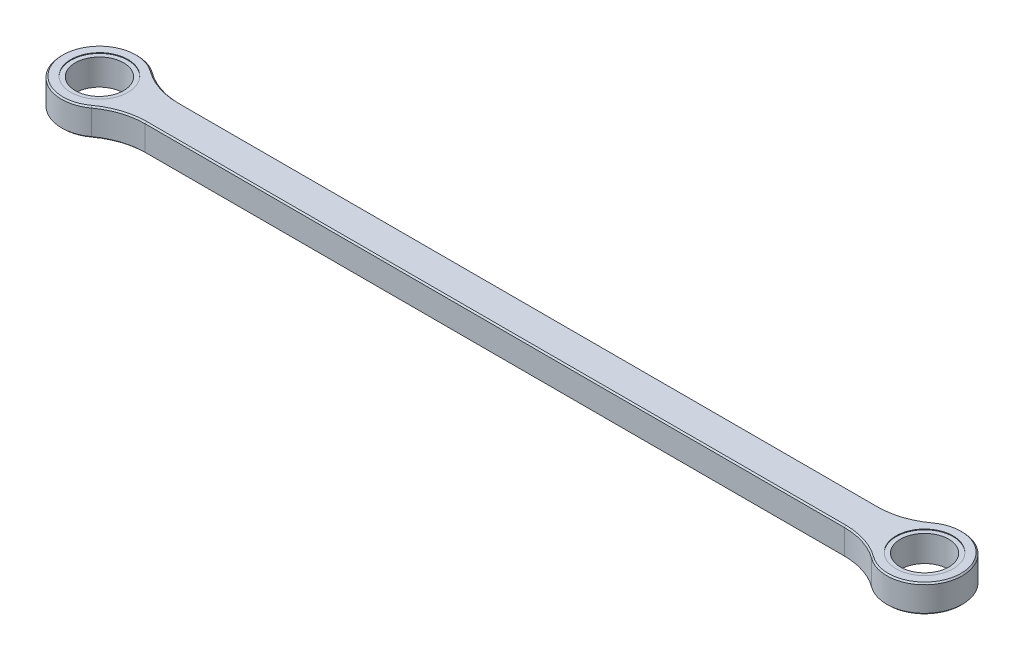
ISO-10303-21;
HEADER;
FILE_DESCRIPTION(('STEP AP214'),'2;1');
FILE_NAME('part.step','',(''),(''),'','','');
FILE_SCHEMA(('AUTOMOTIVE_DESIGN { 1 0 10303 214 1 1 1 1 }'));
ENDSEC;
DATA;
#1=APPLICATION_CONTEXT('core data for automotive mechanical design processes');
#2=APPLICATION_PROTOCOL_DEFINITION('international standard','automotive_design',2000,#1);
#3=PRODUCT_CONTEXT('',#1,'mechanical');
#4=PRODUCT('Part','Part','',(#3));
#5=PRODUCT_RELATED_PRODUCT_CATEGORY('part','',(#4));
#6=PRODUCT_DEFINITION_FORMATION('','',#4);
#7=PRODUCT_DEFINITION_CONTEXT('part definition',#1,'design');
#8=PRODUCT_DEFINITION('design','',#6,#7);
#9=PRODUCT_DEFINITION_SHAPE('','',#8);
#10=(LENGTH_UNIT() NAMED_UNIT(*) SI_UNIT(.MILLI.,.METRE.));
#11=(NAMED_UNIT(*) PLANE_ANGLE_UNIT() SI_UNIT($,.RADIAN.));
#12=(NAMED_UNIT(*) SI_UNIT($,.STERADIAN.) SOLID_ANGLE_UNIT());
#13=UNCERTAINTY_MEASURE_WITH_UNIT(LENGTH_MEASURE(1.E-05),#10,'distance_accuracy_value','');
#14=(GEOMETRIC_REPRESENTATION_CONTEXT(3) GLOBAL_UNCERTAINTY_ASSIGNED_CONTEXT((#13)) GLOBAL_UNIT_ASSIGNED_CONTEXT((#10,
#11,#12)) REPRESENTATION_CONTEXT('',''));
#15=CARTESIAN_POINT('',(0.,0.,0.));
#16=DIRECTION('',(0.,0.,1.));
#17=DIRECTION('',(1.,0.,0.));
#18=AXIS2_PLACEMENT_3D('',#15,#16,#17);
#19=CARTESIAN_POINT('',(0.,4.,0.));
#20=DIRECTION('',(0.,-1.,0.));
#21=DIRECTION('',(0.,0.,-1.));
#22=AXIS2_PLACEMENT_3D('',#19,#20,#21);
#23=CYLINDRICAL_SURFACE('',#22,3.515);
#24=CARTESIAN_POINT('',(0.,3.9,0.));
#25=DIRECTION('',(0.,1.,0.));
#26=DIRECTION('',(0.,0.,1.));
#27=AXIS2_PLACEMENT_3D('',#24,#25,#26);
#28=CIRCLE('',#27,3.515);
#29=CARTESIAN_POINT('',(0.,3.9,3.515));
#30=VERTEX_POINT('',#29);
#31=EDGE_CURVE('E290',#30,#30,#28,.T.);
#32=ORIENTED_EDGE('',*,*,#31,.T.);
#33=EDGE_LOOP('',(#32));
#34=FACE_BOUND('',#33,.T.);
#35=CARTESIAN_POINT('',(0.,0.0999999999999998,0.));
#36=DIRECTION('',(0.,-1.,0.));
#37=DIRECTION('',(0.,0.,-1.));
#38=AXIS2_PLACEMENT_3D('',#35,#36,#37);
#39=CIRCLE('',#38,3.515);
#40=CARTESIAN_POINT('',(0.,0.0999999999999998,-3.515));
#41=VERTEX_POINT('',#40);
#42=EDGE_CURVE('E50',#41,#41,#39,.T.);
#43=ORIENTED_EDGE('',*,*,#42,.T.);
#44=EDGE_LOOP('',(#43));
#45=FACE_BOUND('',#44,.T.);
#46=ADVANCED_FACE('F45',(#34,#45),#23,.F.);
#47=CARTESIAN_POINT('',(120.,4.,0.));
#48=DIRECTION('',(0.,-1.,0.));
#49=DIRECTION('',(0.,0.,-1.));
#50=AXIS2_PLACEMENT_3D('',#47,#48,#49);
#51=CYLINDRICAL_SURFACE('',#50,3.51500000000001);
#52=CARTESIAN_POINT('',(120.,3.9,0.));
#53=DIRECTION('',(0.,1.,0.));
#54=DIRECTION('',(0.,0.,1.));
#55=AXIS2_PLACEMENT_3D('',#52,#53,#54);
#56=CIRCLE('',#55,3.51500000000001);
#57=CARTESIAN_POINT('',(120.,3.9,3.51500000000001));
#58=VERTEX_POINT('',#57);
#59=EDGE_CURVE('E309',#58,#58,#56,.T.);
#60=ORIENTED_EDGE('',*,*,#59,.T.);
#61=EDGE_LOOP('',(#60));
#62=FACE_BOUND('',#61,.T.);
#63=CARTESIAN_POINT('',(120.,0.0999999999999998,0.));
#64=DIRECTION('',(0.,-1.,0.));
#65=DIRECTION('',(0.,0.,-1.));
#66=AXIS2_PLACEMENT_3D('',#63,#64,#65);
#67=CIRCLE('',#66,3.51500000000001);
#68=CARTESIAN_POINT('',(120.,0.0999999999999998,-3.51500000000001));
#69=VERTEX_POINT('',#68);
#70=EDGE_CURVE('E314',#69,#69,#67,.T.);
#71=ORIENTED_EDGE('',*,*,#70,.T.);
#72=EDGE_LOOP('',(#71));
#73=FACE_BOUND('',#72,.T.);
#74=ADVANCED_FACE('F416',(#62,#73),#51,.F.);
#75=CARTESIAN_POINT('',(0.,4.,0.));
#76=DIRECTION('',(0.,1.,0.));
#77=DIRECTION('',(0.,0.,1.));
#78=AXIS2_PLACEMENT_3D('',#75,#76,#77);
#79=PLANE('',#78);
#80=CARTESIAN_POINT('',(0.,4.,0.));
#81=DIRECTION('',(0.,1.,0.));
#82=DIRECTION('',(0.,0.,1.));
#83=AXIS2_PLACEMENT_3D('',#80,#81,#82);
#84=CIRCLE('',#83,4.15);
#85=CARTESIAN_POINT('',(0.,4.,4.15));
#86=VERTEX_POINT('',#85);
#87=EDGE_CURVE('E337',#86,#86,#84,.T.);
#88=ORIENTED_EDGE('',*,*,#87,.F.);
#89=EDGE_LOOP('',(#88));
#90=FACE_BOUND('',#89,.T.);
#91=CARTESIAN_POINT('',(120.,4.,0.));
#92=DIRECTION('',(0.,1.,0.));
#93=DIRECTION('',(0.,0.,1.));
#94=AXIS2_PLACEMENT_3D('',#91,#92,#93);
#95=CIRCLE('',#94,4.15);
#96=CARTESIAN_POINT('',(120.,4.,4.15));
#97=VERTEX_POINT('',#96);
#98=EDGE_CURVE('E340',#97,#97,#95,.T.);
#99=ORIENTED_EDGE('',*,*,#98,.F.);
#100=EDGE_LOOP('',(#99));
#101=FACE_BOUND('',#100,.T.);
#102=CARTESIAN_POINT('',(9.16515138991168,4.,12.5));
#103=DIRECTION('',(0.,1.,0.));
#104=DIRECTION('',(0.,0.,1.));
#105=AXIS2_PLACEMENT_3D('',#102,#103,#104);
#106=CIRCLE('',#105,10.2);
#107=CARTESIAN_POINT('',(3.13389047526011,4.,4.27419354838708));
#108=VERTEX_POINT('',#107);
#109=CARTESIAN_POINT('',(9.16515138991168,4.,2.29999999999998));
#110=VERTEX_POINT('',#109);
#111=EDGE_CURVE('E70',#108,#110,#106,.F.);
#112=ORIENTED_EDGE('',*,*,#111,.T.);
#113=DIRECTION('',(1.,0.,0.));
#114=VECTOR('',#113,1.);
#115=CARTESIAN_POINT('',(110.834848610088,4.,2.29999999999998));
#116=LINE('',#115,#114);
#117=CARTESIAN_POINT('',(110.834848610088,4.,2.29999999999998));
#118=VERTEX_POINT('',#117);
#119=EDGE_CURVE('E11',#110,#118,#116,.T.);
#120=ORIENTED_EDGE('',*,*,#119,.T.);
#121=CARTESIAN_POINT('',(110.834848610088,4.,12.5));
#122=DIRECTION('',(0.,1.,0.));
#123=DIRECTION('',(0.,0.,1.));
#124=AXIS2_PLACEMENT_3D('',#121,#122,#123);
#125=CIRCLE('',#124,10.2);
#126=CARTESIAN_POINT('',(116.86610952474,4.,4.27419354838708));
#127=VERTEX_POINT('',#126);
#128=EDGE_CURVE('E55',#118,#127,#125,.F.);
#129=ORIENTED_EDGE('',*,*,#128,.T.);
#130=CARTESIAN_POINT('',(120.,4.,0.));
#131=DIRECTION('',(0.,1.,0.));
#132=DIRECTION('',(0.,0.,1.));
#133=AXIS2_PLACEMENT_3D('',#130,#131,#132);
#134=CIRCLE('',#133,5.29999999999999);
#135=CARTESIAN_POINT('',(116.86610952474,4.,-4.27419354838708));
#136=VERTEX_POINT('',#135);
#137=EDGE_CURVE('E266',#127,#136,#134,.T.);
#138=ORIENTED_EDGE('',*,*,#137,.T.);
#139=CARTESIAN_POINT('',(110.834848610088,4.,-12.5));
#140=DIRECTION('',(0.,1.,0.));
#141=DIRECTION('',(0.,0.,1.));
#142=AXIS2_PLACEMENT_3D('',#139,#140,#141);
#143=CIRCLE('',#142,10.2);
#144=CARTESIAN_POINT('',(110.834848610088,4.,-2.29999999999998));
#145=VERTEX_POINT('',#144);
#146=EDGE_CURVE('E262',#136,#145,#143,.F.);
#147=ORIENTED_EDGE('',*,*,#146,.T.);
#148=DIRECTION('',(-1.,0.,0.));
#149=VECTOR('',#148,1.);
#150=CARTESIAN_POINT('',(9.16515138991168,4.,-2.29999999999998));
#151=LINE('',#150,#149);
#152=CARTESIAN_POINT('',(9.16515138991168,4.,-2.29999999999998));
#153=VERTEX_POINT('',#152);
#154=EDGE_CURVE('E258',#145,#153,#151,.T.);
#155=ORIENTED_EDGE('',*,*,#154,.T.);
#156=CARTESIAN_POINT('',(9.16515138991168,4.,-12.5));
#157=DIRECTION('',(0.,1.,0.));
#158=DIRECTION('',(0.,0.,1.));
#159=AXIS2_PLACEMENT_3D('',#156,#157,#158);
#160=CIRCLE('',#159,10.2);
#161=CARTESIAN_POINT('',(3.13389047526011,4.,-4.27419354838708));
#162=VERTEX_POINT('',#161);
#163=EDGE_CURVE('E260',#153,#162,#160,.F.);
#164=ORIENTED_EDGE('',*,*,#163,.T.);
#165=CARTESIAN_POINT('',(0.,4.,0.));
#166=DIRECTION('',(0.,1.,0.));
#167=DIRECTION('',(0.,0.,1.));
#168=AXIS2_PLACEMENT_3D('',#165,#166,#167);
#169=CIRCLE('',#168,5.29999999999998);
#170=EDGE_CURVE('E264',#162,#108,#169,.T.);
#171=ORIENTED_EDGE('',*,*,#170,.T.);
#172=EDGE_LOOP('',(#112,#120,#129,#138,#147,#155,#164,#171));
#173=FACE_BOUND('',#172,.T.);
#174=ADVANCED_FACE('F397',(#90,#101,#173),#79,.T.);
#175=CARTESIAN_POINT('',(0.,0.,0.));
#176=DIRECTION('',(0.,1.,0.));
#177=DIRECTION('',(0.,0.,1.));
#178=AXIS2_PLACEMENT_3D('',#175,#176,#177);
#179=PLANE('',#178);
#180=CARTESIAN_POINT('',(0.,0.,0.));
#181=DIRECTION('',(0.,-1.,0.));
#182=DIRECTION('',(0.,0.,-1.));
#183=AXIS2_PLACEMENT_3D('',#180,#181,#182);
#184=CIRCLE('',#183,4.125);
#185=CARTESIAN_POINT('',(0.,0.,-4.125));
#186=VERTEX_POINT('',#185);
#187=EDGE_CURVE('E322',#186,#186,#184,.T.);
#188=ORIENTED_EDGE('',*,*,#187,.F.);
#189=EDGE_LOOP('',(#188));
#190=FACE_BOUND('',#189,.T.);
#191=CARTESIAN_POINT('',(120.,0.,0.));
#192=DIRECTION('',(0.,-1.,0.));
#193=DIRECTION('',(0.,0.,-1.));
#194=AXIS2_PLACEMENT_3D('',#191,#192,#193);
#195=CIRCLE('',#194,4.125);
#196=CARTESIAN_POINT('',(120.,0.,-4.125));
#197=VERTEX_POINT('',#196);
#198=EDGE_CURVE('E327',#197,#197,#195,.T.);
#199=ORIENTED_EDGE('',*,*,#198,.F.);
#200=EDGE_LOOP('',(#199));
#201=FACE_BOUND('',#200,.T.);
#202=CARTESIAN_POINT('',(110.834848610088,0.,12.5));
#203=DIRECTION('',(0.,1.,0.));
#204=DIRECTION('',(0.,0.,1.));
#205=AXIS2_PLACEMENT_3D('',#202,#203,#204);
#206=CIRCLE('',#205,10.2);
#207=CARTESIAN_POINT('',(116.86610952474,0.,4.27419354838709));
#208=VERTEX_POINT('',#207);
#209=CARTESIAN_POINT('',(110.834848610088,0.,2.29999999999999));
#210=VERTEX_POINT('',#209);
#211=EDGE_CURVE('E231',#208,#210,#206,.T.);
#212=ORIENTED_EDGE('',*,*,#211,.T.);
#213=DIRECTION('',(-1.,0.,0.));
#214=VECTOR('',#213,1.);
#215=CARTESIAN_POINT('',(0.,0.,2.29999999999999));
#216=LINE('',#215,#214);
#217=CARTESIAN_POINT('',(9.16515138991168,0.,2.29999999999999));
#218=VERTEX_POINT('',#217);
#219=EDGE_CURVE('E170',#210,#218,#216,.T.);
#220=ORIENTED_EDGE('',*,*,#219,.T.);
#221=CARTESIAN_POINT('',(9.16515138991168,0.,12.5));
#222=DIRECTION('',(0.,1.,0.));
#223=DIRECTION('',(0.,0.,1.));
#224=AXIS2_PLACEMENT_3D('',#221,#222,#223);
#225=CIRCLE('',#224,10.2);
#226=CARTESIAN_POINT('',(3.13389047526012,0.,4.27419354838709));
#227=VERTEX_POINT('',#226);
#228=EDGE_CURVE('E229',#218,#227,#225,.T.);
#229=ORIENTED_EDGE('',*,*,#228,.T.);
#230=CARTESIAN_POINT('',(0.,0.,0.));
#231=DIRECTION('',(0.,1.,0.));
#232=DIRECTION('',(0.,0.,1.));
#233=AXIS2_PLACEMENT_3D('',#230,#231,#232);
#234=CIRCLE('',#233,5.29999999999999);
#235=CARTESIAN_POINT('',(3.13389047526012,0.,-4.27419354838709));
#236=VERTEX_POINT('',#235);
#237=EDGE_CURVE('E225',#227,#236,#234,.F.);
#238=ORIENTED_EDGE('',*,*,#237,.T.);
#239=CARTESIAN_POINT('',(9.16515138991168,0.,-12.5));
#240=DIRECTION('',(0.,1.,0.));
#241=DIRECTION('',(0.,0.,1.));
#242=AXIS2_PLACEMENT_3D('',#239,#240,#241);
#243=CIRCLE('',#242,10.2);
#244=CARTESIAN_POINT('',(9.16515138991168,0.,-2.29999999999999));
#245=VERTEX_POINT('',#244);
#246=EDGE_CURVE('E221',#236,#245,#243,.T.);
#247=ORIENTED_EDGE('',*,*,#246,.T.);
#248=DIRECTION('',(1.,0.,0.));
#249=VECTOR('',#248,1.);
#250=CARTESIAN_POINT('',(0.,0.,-2.29999999999999));
#251=LINE('',#250,#249);
#252=CARTESIAN_POINT('',(110.834848610088,0.,-2.29999999999999));
#253=VERTEX_POINT('',#252);
#254=EDGE_CURVE('E197',#245,#253,#251,.T.);
#255=ORIENTED_EDGE('',*,*,#254,.T.);
#256=CARTESIAN_POINT('',(110.834848610088,0.,-12.5));
#257=DIRECTION('',(0.,1.,0.));
#258=DIRECTION('',(0.,0.,1.));
#259=AXIS2_PLACEMENT_3D('',#256,#257,#258);
#260=CIRCLE('',#259,10.2);
#261=CARTESIAN_POINT('',(116.86610952474,0.,-4.27419354838709));
#262=VERTEX_POINT('',#261);
#263=EDGE_CURVE('E223',#253,#262,#260,.T.);
#264=ORIENTED_EDGE('',*,*,#263,.T.);
#265=CARTESIAN_POINT('',(120.,0.,0.));
#266=DIRECTION('',(0.,1.,0.));
#267=DIRECTION('',(0.,0.,1.));
#268=AXIS2_PLACEMENT_3D('',#265,#266,#267);
#269=CIRCLE('',#268,5.3);
#270=EDGE_CURVE('E227',#262,#208,#269,.F.);
#271=ORIENTED_EDGE('',*,*,#270,.T.);
#272=EDGE_LOOP('',(#212,#220,#229,#238,#247,#255,#264,#271));
#273=FACE_BOUND('',#272,.T.);
#274=ADVANCED_FACE('F430',(#190,#201,#273),#179,.F.);
#275=CARTESIAN_POINT('',(0.,4.,0.));
#276=DIRECTION('',(0.,-1.,0.));
#277=DIRECTION('',(0.,0.,-1.));
#278=AXIS2_PLACEMENT_3D('',#275,#276,#277);
#279=CYLINDRICAL_SURFACE('',#278,5.5);
#280=DIRECTION('',(0.,-1.,0.));
#281=VECTOR('',#280,1.);
#282=CARTESIAN_POINT('',(3.25215049319447,4.,-4.43548387096774));
#283=LINE('',#282,#281);
#284=CARTESIAN_POINT('',(3.25215049319447,3.79999999999999,-4.43548387096774));
#285=VERTEX_POINT('',#284);
#286=CARTESIAN_POINT('',(3.25215049319447,0.199999999999992,-4.43548387096774));
#287=VERTEX_POINT('',#286);
#288=EDGE_CURVE('E213',#285,#287,#283,.T.);
#289=ORIENTED_EDGE('',*,*,#288,.T.);
#290=CARTESIAN_POINT('',(0.,0.199999999999992,0.));
#291=DIRECTION('',(0.,1.,0.));
#292=DIRECTION('',(0.,0.,1.));
#293=AXIS2_PLACEMENT_3D('',#290,#291,#292);
#294=CIRCLE('',#293,5.5);
#295=CARTESIAN_POINT('',(3.25215049319447,0.199999999999992,4.43548387096774));
#296=VERTEX_POINT('',#295);
#297=EDGE_CURVE('E244',#287,#296,#294,.T.);
#298=ORIENTED_EDGE('',*,*,#297,.T.);
#299=DIRECTION('',(0.,-1.,0.));
#300=VECTOR('',#299,1.);
#301=CARTESIAN_POINT('',(3.25215049319447,4.,4.43548387096774));
#302=LINE('',#301,#300);
#303=CARTESIAN_POINT('',(3.25215049319447,3.79999999999999,4.43548387096774));
#304=VERTEX_POINT('',#303);
#305=EDGE_CURVE('E216',#296,#304,#302,.F.);
#306=ORIENTED_EDGE('',*,*,#305,.T.);
#307=CARTESIAN_POINT('',(0.,3.79999999999999,0.));
#308=DIRECTION('',(0.,1.,0.));
#309=DIRECTION('',(0.,0.,1.));
#310=AXIS2_PLACEMENT_3D('',#307,#308,#309);
#311=CIRCLE('',#310,5.5);
#312=EDGE_CURVE('E242',#304,#285,#311,.F.);
#313=ORIENTED_EDGE('',*,*,#312,.T.);
#314=EDGE_LOOP('',(#289,#298,#306,#313));
#315=FACE_BOUND('',#314,.T.);
#316=ADVANCED_FACE('F385',(#315),#279,.T.);
#317=CARTESIAN_POINT('',(4.89897948556636,4.,2.5));
#318=DIRECTION('',(0.,0.,-1.));
#319=DIRECTION('',(-1.,0.,0.));
#320=AXIS2_PLACEMENT_3D('',#317,#318,#319);
#321=PLANE('',#320);
#322=DIRECTION('',(0.,1.,0.));
#323=VECTOR('',#322,1.);
#324=CARTESIAN_POINT('',(9.16515138991168,0.,2.5));
#325=LINE('',#324,#323);
#326=CARTESIAN_POINT('',(9.16515138991168,3.79999999999999,2.5));
#327=VERTEX_POINT('',#326);
#328=CARTESIAN_POINT('',(9.16515138991168,0.199999999999992,2.5));
#329=VERTEX_POINT('',#328);
#330=EDGE_CURVE('E195',#327,#329,#325,.F.);
#331=ORIENTED_EDGE('',*,*,#330,.T.);
#332=DIRECTION('',(1.,0.,0.));
#333=VECTOR('',#332,1.);
#334=CARTESIAN_POINT('',(4.89897948556636,0.199999999999992,2.5));
#335=LINE('',#334,#333);
#336=CARTESIAN_POINT('',(110.834848610088,0.199999999999992,2.5));
#337=VERTEX_POINT('',#336);
#338=EDGE_CURVE('E168',#329,#337,#335,.T.);
#339=ORIENTED_EDGE('',*,*,#338,.T.);
#340=DIRECTION('',(0.,1.,0.));
#341=VECTOR('',#340,1.);
#342=CARTESIAN_POINT('',(110.834848610088,4.,2.5));
#343=LINE('',#342,#341);
#344=CARTESIAN_POINT('',(110.834848610088,3.79999999999999,2.5));
#345=VERTEX_POINT('',#344);
#346=EDGE_CURVE('E193',#337,#345,#343,.T.);
#347=ORIENTED_EDGE('',*,*,#346,.T.);
#348=DIRECTION('',(-1.,0.,0.));
#349=VECTOR('',#348,1.);
#350=CARTESIAN_POINT('',(9.16515138991168,3.79999999999999,2.5));
#351=LINE('',#350,#349);
#352=EDGE_CURVE('E198',#345,#327,#351,.T.);
#353=ORIENTED_EDGE('',*,*,#352,.T.);
#354=EDGE_LOOP('',(#331,#339,#347,#353));
#355=FACE_BOUND('',#354,.T.);
#356=ADVANCED_FACE('F191',(#355),#321,.F.);
#357=CARTESIAN_POINT('',(120.,4.,0.));
#358=DIRECTION('',(0.,-1.,0.));
#359=DIRECTION('',(0.,0.,-1.));
#360=AXIS2_PLACEMENT_3D('',#357,#358,#359);
#361=CYLINDRICAL_SURFACE('',#360,5.50000000000001);
#362=DIRECTION('',(0.,-1.,0.));
#363=VECTOR('',#362,1.);
#364=CARTESIAN_POINT('',(116.747849506806,4.,4.43548387096774));
#365=LINE('',#364,#363);
#366=CARTESIAN_POINT('',(116.747849506806,3.79999999999999,4.43548387096774));
#367=VERTEX_POINT('',#366);
#368=CARTESIAN_POINT('',(116.747849506806,0.199999999999992,4.43548387096774));
#369=VERTEX_POINT('',#368);
#370=EDGE_CURVE('E207',#367,#369,#365,.T.);
#371=ORIENTED_EDGE('',*,*,#370,.T.);
#372=CARTESIAN_POINT('',(120.,0.199999999999992,0.));
#373=DIRECTION('',(0.,1.,0.));
#374=DIRECTION('',(0.,0.,1.));
#375=AXIS2_PLACEMENT_3D('',#372,#373,#374);
#376=CIRCLE('',#375,5.50000000000001);
#377=CARTESIAN_POINT('',(116.747849506806,0.199999999999992,-4.43548387096774));
#378=VERTEX_POINT('',#377);
#379=EDGE_CURVE('E240',#369,#378,#376,.T.);
#380=ORIENTED_EDGE('',*,*,#379,.T.);
#381=DIRECTION('',(0.,-1.,0.));
#382=VECTOR('',#381,1.);
#383=CARTESIAN_POINT('',(116.747849506806,4.,-4.43548387096774));
#384=LINE('',#383,#382);
#385=CARTESIAN_POINT('',(116.747849506806,3.79999999999999,-4.43548387096774));
#386=VERTEX_POINT('',#385);
#387=EDGE_CURVE('E287',#378,#386,#384,.F.);
#388=ORIENTED_EDGE('',*,*,#387,.T.);
#389=CARTESIAN_POINT('',(120.,3.79999999999999,0.));
#390=DIRECTION('',(0.,1.,0.));
#391=DIRECTION('',(0.,0.,1.));
#392=AXIS2_PLACEMENT_3D('',#389,#390,#391);
#393=CIRCLE('',#392,5.50000000000001);
#394=EDGE_CURVE('E238',#386,#367,#393,.F.);
#395=ORIENTED_EDGE('',*,*,#394,.T.);
#396=EDGE_LOOP('',(#371,#380,#388,#395));
#397=FACE_BOUND('',#396,.T.);
#398=ADVANCED_FACE('F348',(#397),#361,.T.);
#399=CARTESIAN_POINT('',(4.89897948556636,4.,-2.5));
#400=DIRECTION('',(0.,0.,1.));
#401=DIRECTION('',(1.,0.,0.));
#402=AXIS2_PLACEMENT_3D('',#399,#400,#401);
#403=PLANE('',#402);
#404=DIRECTION('',(0.,1.,0.));
#405=VECTOR('',#404,1.);
#406=CARTESIAN_POINT('',(110.834848610088,0.,-2.5));
#407=LINE('',#406,#405);
#408=CARTESIAN_POINT('',(110.834848610088,3.79999999999999,-2.5));
#409=VERTEX_POINT('',#408);
#410=CARTESIAN_POINT('',(110.834848610088,0.199999999999992,-2.5));
#411=VERTEX_POINT('',#410);
#412=EDGE_CURVE('E205',#409,#411,#407,.F.);
#413=ORIENTED_EDGE('',*,*,#412,.T.);
#414=DIRECTION('',(-1.,0.,0.));
#415=VECTOR('',#414,1.);
#416=CARTESIAN_POINT('',(4.89897948556636,0.199999999999992,-2.5));
#417=LINE('',#416,#415);
#418=CARTESIAN_POINT('',(9.16515138991168,0.199999999999992,-2.5));
#419=VERTEX_POINT('',#418);
#420=EDGE_CURVE('E256',#411,#419,#417,.T.);
#421=ORIENTED_EDGE('',*,*,#420,.T.);
#422=DIRECTION('',(0.,1.,0.));
#423=VECTOR('',#422,1.);
#424=CARTESIAN_POINT('',(9.16515138991168,4.,-2.5));
#425=LINE('',#424,#423);
#426=CARTESIAN_POINT('',(9.16515138991168,3.79999999999999,-2.5));
#427=VERTEX_POINT('',#426);
#428=EDGE_CURVE('E202',#419,#427,#425,.T.);
#429=ORIENTED_EDGE('',*,*,#428,.T.);
#430=DIRECTION('',(1.,0.,0.));
#431=VECTOR('',#430,1.);
#432=CARTESIAN_POINT('',(110.834848610088,3.79999999999999,-2.5));
#433=LINE('',#432,#431);
#434=EDGE_CURVE('E254',#427,#409,#433,.T.);
#435=ORIENTED_EDGE('',*,*,#434,.T.);
#436=EDGE_LOOP('',(#413,#421,#429,#435));
#437=FACE_BOUND('',#436,.T.);
#438=ADVANCED_FACE('F367',(#437),#403,.F.);
#439=CARTESIAN_POINT('',(110.834848610088,4.,12.5));
#440=DIRECTION('',(0.,-1.,0.));
#441=DIRECTION('',(0.,0.,-1.));
#442=AXIS2_PLACEMENT_3D('',#439,#440,#441);
#443=CYLINDRICAL_SURFACE('',#442,10.);
#444=ORIENTED_EDGE('',*,*,#346,.F.);
#445=CARTESIAN_POINT('',(110.834848610088,0.199999999999992,12.5));
#446=DIRECTION('',(0.,1.,0.));
#447=DIRECTION('',(0.,0.,1.));
#448=AXIS2_PLACEMENT_3D('',#445,#446,#447);
#449=CIRCLE('',#448,10.);
#450=EDGE_CURVE('E177',#337,#369,#449,.F.);
#451=ORIENTED_EDGE('',*,*,#450,.T.);
#452=ORIENTED_EDGE('',*,*,#370,.F.);
#453=CARTESIAN_POINT('',(110.834848610088,3.79999999999999,12.5));
#454=DIRECTION('',(0.,1.,0.));
#455=DIRECTION('',(0.,0.,1.));
#456=AXIS2_PLACEMENT_3D('',#453,#454,#455);
#457=CIRCLE('',#456,10.);
#458=EDGE_CURVE('E186',#367,#345,#457,.T.);
#459=ORIENTED_EDGE('',*,*,#458,.T.);
#460=EDGE_LOOP('',(#444,#451,#452,#459));
#461=FACE_BOUND('',#460,.T.);
#462=ADVANCED_FACE('F200',(#461),#443,.F.);
#463=CARTESIAN_POINT('',(110.834848610088,4.,-12.5));
#464=DIRECTION('',(0.,-1.,0.));
#465=DIRECTION('',(0.,0.,-1.));
#466=AXIS2_PLACEMENT_3D('',#463,#464,#465);
#467=CYLINDRICAL_SURFACE('',#466,10.);
#468=ORIENTED_EDGE('',*,*,#387,.F.);
#469=CARTESIAN_POINT('',(110.834848610088,0.199999999999992,-12.5));
#470=DIRECTION('',(0.,1.,0.));
#471=DIRECTION('',(0.,0.,1.));
#472=AXIS2_PLACEMENT_3D('',#469,#470,#471);
#473=CIRCLE('',#472,10.);
#474=EDGE_CURVE('E248',#378,#411,#473,.F.);
#475=ORIENTED_EDGE('',*,*,#474,.T.);
#476=ORIENTED_EDGE('',*,*,#412,.F.);
#477=CARTESIAN_POINT('',(110.834848610088,3.79999999999999,-12.5));
#478=DIRECTION('',(0.,1.,0.));
#479=DIRECTION('',(0.,0.,1.));
#480=AXIS2_PLACEMENT_3D('',#477,#478,#479);
#481=CIRCLE('',#480,10.);
#482=EDGE_CURVE('E246',#409,#386,#481,.T.);
#483=ORIENTED_EDGE('',*,*,#482,.T.);
#484=EDGE_LOOP('',(#468,#475,#476,#483));
#485=FACE_BOUND('',#484,.T.);
#486=ADVANCED_FACE('F363',(#485),#467,.F.);
#487=CARTESIAN_POINT('',(9.16515138991168,4.,12.5));
#488=DIRECTION('',(0.,-1.,0.));
#489=DIRECTION('',(0.,0.,-1.));
#490=AXIS2_PLACEMENT_3D('',#487,#488,#489);
#491=CYLINDRICAL_SURFACE('',#490,10.);
#492=ORIENTED_EDGE('',*,*,#305,.F.);
#493=CARTESIAN_POINT('',(9.16515138991168,0.199999999999992,12.5));
#494=DIRECTION('',(0.,1.,0.));
#495=DIRECTION('',(0.,0.,1.));
#496=AXIS2_PLACEMENT_3D('',#493,#494,#495);
#497=CIRCLE('',#496,10.);
#498=EDGE_CURVE('E236',#296,#329,#497,.F.);
#499=ORIENTED_EDGE('',*,*,#498,.T.);
#500=ORIENTED_EDGE('',*,*,#330,.F.);
#501=CARTESIAN_POINT('',(9.16515138991168,3.79999999999999,12.5));
#502=DIRECTION('',(0.,1.,0.));
#503=DIRECTION('',(0.,0.,1.));
#504=AXIS2_PLACEMENT_3D('',#501,#502,#503);
#505=CIRCLE('',#504,10.);
#506=EDGE_CURVE('E185',#327,#304,#505,.T.);
#507=ORIENTED_EDGE('',*,*,#506,.T.);
#508=EDGE_LOOP('',(#492,#499,#500,#507));
#509=FACE_BOUND('',#508,.T.);
#510=ADVANCED_FACE('F447',(#509),#491,.F.);
#511=CARTESIAN_POINT('',(9.16515138991168,4.,-12.5));
#512=DIRECTION('',(0.,-1.,0.));
#513=DIRECTION('',(0.,0.,-1.));
#514=AXIS2_PLACEMENT_3D('',#511,#512,#513);
#515=CYLINDRICAL_SURFACE('',#514,10.);
#516=ORIENTED_EDGE('',*,*,#428,.F.);
#517=CARTESIAN_POINT('',(9.16515138991168,0.199999999999992,-12.5));
#518=DIRECTION('',(0.,1.,0.));
#519=DIRECTION('',(0.,0.,1.));
#520=AXIS2_PLACEMENT_3D('',#517,#518,#519);
#521=CIRCLE('',#520,10.);
#522=EDGE_CURVE('E252',#419,#287,#521,.F.);
#523=ORIENTED_EDGE('',*,*,#522,.T.);
#524=ORIENTED_EDGE('',*,*,#288,.F.);
#525=CARTESIAN_POINT('',(9.16515138991168,3.79999999999999,-12.5));
#526=DIRECTION('',(0.,1.,0.));
#527=DIRECTION('',(0.,0.,1.));
#528=AXIS2_PLACEMENT_3D('',#525,#526,#527);
#529=CIRCLE('',#528,10.);
#530=EDGE_CURVE('E250',#285,#427,#529,.T.);
#531=ORIENTED_EDGE('',*,*,#530,.T.);
#532=EDGE_LOOP('',(#516,#523,#524,#531));
#533=FACE_BOUND('',#532,.T.);
#534=ADVANCED_FACE('F382',(#533),#515,.F.);
#535=CARTESIAN_POINT('',(4.89897948556636,0.199999999999992,-2.5));
#536=DIRECTION('',(0.,0.707106781186572,0.707106781186523));
#537=DIRECTION('',(-1.,0.,0.));
#538=AXIS2_PLACEMENT_3D('',#535,#536,#537);
#539=PLANE('',#538);
#540=DIRECTION('',(0.,0.707106781186523,-0.707106781186572));
#541=VECTOR('',#540,1.);
#542=CARTESIAN_POINT('',(110.834848610088,0.,-2.29999999999999));
#543=LINE('',#542,#541);
#544=EDGE_CURVE('E281',#253,#411,#543,.T.);
#545=ORIENTED_EDGE('',*,*,#544,.F.);
#546=ORIENTED_EDGE('',*,*,#254,.F.);
#547=DIRECTION('',(0.,-0.707106781186523,0.707106781186572));
#548=VECTOR('',#547,1.);
#549=CARTESIAN_POINT('',(9.16515138991168,0.199999999999992,-2.5));
#550=LINE('',#549,#548);
#551=EDGE_CURVE('E284',#419,#245,#550,.T.);
#552=ORIENTED_EDGE('',*,*,#551,.F.);
#553=ORIENTED_EDGE('',*,*,#420,.F.);
#554=EDGE_LOOP('',(#545,#546,#552,#553));
#555=FACE_BOUND('',#554,.T.);
#556=ADVANCED_FACE('F372',(#555),#539,.F.);
#557=CARTESIAN_POINT('',(9.16515138991168,0.,-12.5));
#558=DIRECTION('',(0.,-1.,0.));
#559=DIRECTION('',(0.,0.,-1.));
#560=AXIS2_PLACEMENT_3D('',#557,#558,#559);
#561=CONICAL_SURFACE('',#560,10.2,0.785398163397483);
#562=ORIENTED_EDGE('',*,*,#551,.T.);
#563=ORIENTED_EDGE('',*,*,#246,.F.);
#564=DIRECTION('',(-0.418112303123102,-0.707106781186524,0.570247404182719));
#565=VECTOR('',#564,1.);
#566=CARTESIAN_POINT('',(3.25215049319447,0.199999999999992,-4.43548387096774));
#567=LINE('',#566,#565);
#568=EDGE_CURVE('E278',#287,#236,#567,.T.);
#569=ORIENTED_EDGE('',*,*,#568,.F.);
#570=ORIENTED_EDGE('',*,*,#522,.F.);
#571=EDGE_LOOP('',(#562,#563,#569,#570));
#572=FACE_BOUND('',#571,.T.);
#573=ADVANCED_FACE('F378',(#572),#561,.F.);
#574=CARTESIAN_POINT('',(110.834848610088,0.,-12.5));
#575=DIRECTION('',(0.,-1.,0.));
#576=DIRECTION('',(0.,0.,-1.));
#577=AXIS2_PLACEMENT_3D('',#574,#575,#576);
#578=CONICAL_SURFACE('',#577,10.2,0.785398163397483);
#579=ORIENTED_EDGE('',*,*,#544,.T.);
#580=ORIENTED_EDGE('',*,*,#474,.F.);
#581=DIRECTION('',(-0.41811230312309,0.707106781186527,-0.570247404182724));
#582=VECTOR('',#581,1.);
#583=CARTESIAN_POINT('',(116.86610952474,0.,-4.27419354838709));
#584=LINE('',#583,#582);
#585=EDGE_CURVE('E275',#262,#378,#584,.T.);
#586=ORIENTED_EDGE('',*,*,#585,.F.);
#587=ORIENTED_EDGE('',*,*,#263,.F.);
#588=EDGE_LOOP('',(#579,#580,#586,#587));
#589=FACE_BOUND('',#588,.T.);
#590=ADVANCED_FACE('F359',(#589),#578,.F.);
#591=CARTESIAN_POINT('',(0.,0.199999999999992,0.));
#592=DIRECTION('',(0.,1.,0.));
#593=DIRECTION('',(0.,0.,1.));
#594=AXIS2_PLACEMENT_3D('',#591,#592,#593);
#595=CONICAL_SURFACE('',#594,5.5,0.785398163397483);
#596=ORIENTED_EDGE('',*,*,#568,.T.);
#597=ORIENTED_EDGE('',*,*,#237,.F.);
#598=DIRECTION('',(-0.418112303123103,-0.707106781186523,-0.570247404182718));
#599=VECTOR('',#598,1.);
#600=CARTESIAN_POINT('',(3.25215049319447,0.199999999999992,4.43548387096774));
#601=LINE('',#600,#599);
#602=EDGE_CURVE('E272',#296,#227,#601,.T.);
#603=ORIENTED_EDGE('',*,*,#602,.F.);
#604=ORIENTED_EDGE('',*,*,#297,.F.);
#605=EDGE_LOOP('',(#596,#597,#603,#604));
#606=FACE_BOUND('',#605,.T.);
#607=ADVANCED_FACE('F476',(#606),#595,.T.);
#608=CARTESIAN_POINT('',(120.,0.199999999999992,0.));
#609=DIRECTION('',(0.,1.,0.));
#610=DIRECTION('',(0.,0.,1.));
#611=AXIS2_PLACEMENT_3D('',#608,#609,#610);
#612=CONICAL_SURFACE('',#611,5.50000000000001,0.785398163397479);
#613=ORIENTED_EDGE('',*,*,#585,.T.);
#614=ORIENTED_EDGE('',*,*,#379,.F.);
#615=DIRECTION('',(-0.418112303123089,0.707106781186525,0.570247404182726));
#616=VECTOR('',#615,1.);
#617=CARTESIAN_POINT('',(116.86610952474,0.,4.27419354838709));
#618=LINE('',#617,#616);
#619=EDGE_CURVE('E180',#208,#369,#618,.T.);
#620=ORIENTED_EDGE('',*,*,#619,.F.);
#621=ORIENTED_EDGE('',*,*,#270,.F.);
#622=EDGE_LOOP('',(#613,#614,#620,#621));
#623=FACE_BOUND('',#622,.T.);
#624=ADVANCED_FACE('F353',(#623),#612,.T.);
#625=CARTESIAN_POINT('',(9.16515138991168,0.,12.5));
#626=DIRECTION('',(0.,-1.,0.));
#627=DIRECTION('',(0.,0.,-1.));
#628=AXIS2_PLACEMENT_3D('',#625,#626,#627);
#629=CONICAL_SURFACE('',#628,10.2,0.785398163397483);
#630=ORIENTED_EDGE('',*,*,#602,.T.);
#631=ORIENTED_EDGE('',*,*,#228,.F.);
#632=DIRECTION('',(0.,-0.707106781186523,-0.707106781186572));
#633=VECTOR('',#632,1.);
#634=CARTESIAN_POINT('',(9.16515138991168,0.199999999999992,2.5));
#635=LINE('',#634,#633);
#636=EDGE_CURVE('E173',#329,#218,#635,.T.);
#637=ORIENTED_EDGE('',*,*,#636,.F.);
#638=ORIENTED_EDGE('',*,*,#498,.F.);
#639=EDGE_LOOP('',(#630,#631,#637,#638));
#640=FACE_BOUND('',#639,.T.);
#641=ADVANCED_FACE('F464',(#640),#629,.F.);
#642=CARTESIAN_POINT('',(110.834848610088,0.,12.5));
#643=DIRECTION('',(0.,-1.,0.));
#644=DIRECTION('',(0.,0.,-1.));
#645=AXIS2_PLACEMENT_3D('',#642,#643,#644);
#646=CONICAL_SURFACE('',#645,10.2,0.785398163397483);
#647=ORIENTED_EDGE('',*,*,#619,.T.);
#648=ORIENTED_EDGE('',*,*,#450,.F.);
#649=DIRECTION('',(0.,0.707106781186523,0.707106781186572));
#650=VECTOR('',#649,1.);
#651=CARTESIAN_POINT('',(110.834848610088,0.,2.29999999999999));
#652=LINE('',#651,#650);
#653=EDGE_CURVE('E164',#210,#337,#652,.T.);
#654=ORIENTED_EDGE('',*,*,#653,.F.);
#655=ORIENTED_EDGE('',*,*,#211,.F.);
#656=EDGE_LOOP('',(#647,#648,#654,#655));
#657=FACE_BOUND('',#656,.T.);
#658=ADVANCED_FACE('F178',(#657),#646,.F.);
#659=CARTESIAN_POINT('',(4.89897948556636,0.199999999999992,2.5));
#660=DIRECTION('',(0.,0.707106781186572,-0.707106781186523));
#661=DIRECTION('',(1.,0.,0.));
#662=AXIS2_PLACEMENT_3D('',#659,#660,#661);
#663=PLANE('',#662);
#664=ORIENTED_EDGE('',*,*,#636,.T.);
#665=ORIENTED_EDGE('',*,*,#219,.F.);
#666=ORIENTED_EDGE('',*,*,#653,.T.);
#667=ORIENTED_EDGE('',*,*,#338,.F.);
#668=EDGE_LOOP('',(#664,#665,#666,#667));
#669=FACE_BOUND('',#668,.T.);
#670=ADVANCED_FACE('F166',(#669),#663,.F.);
#671=CARTESIAN_POINT('',(0.,4.,-2.29999999999998));
#672=DIRECTION('',(0.,0.707106781186572,-0.707106781186523));
#673=DIRECTION('',(1.,0.,0.));
#674=AXIS2_PLACEMENT_3D('',#671,#672,#673);
#675=PLANE('',#674);
#676=DIRECTION('',(0.,0.707106781186523,0.707106781186572));
#677=VECTOR('',#676,1.);
#678=CARTESIAN_POINT('',(110.834848610088,3.79999999999999,-2.5));
#679=LINE('',#678,#677);
#680=EDGE_CURVE('E304',#409,#145,#679,.T.);
#681=ORIENTED_EDGE('',*,*,#680,.F.);
#682=ORIENTED_EDGE('',*,*,#434,.F.);
#683=DIRECTION('',(0.,-0.707106781186523,-0.707106781186572));
#684=VECTOR('',#683,1.);
#685=CARTESIAN_POINT('',(9.16515138991168,4.,-2.29999999999998));
#686=LINE('',#685,#684);
#687=EDGE_CURVE('E174',#153,#427,#686,.T.);
#688=ORIENTED_EDGE('',*,*,#687,.F.);
#689=ORIENTED_EDGE('',*,*,#154,.F.);
#690=EDGE_LOOP('',(#681,#682,#688,#689));
#691=FACE_BOUND('',#690,.T.);
#692=ADVANCED_FACE('F48',(#691),#675,.T.);
#693=CARTESIAN_POINT('',(9.16515138991168,4.,-12.5));
#694=DIRECTION('',(0.,1.,0.));
#695=DIRECTION('',(0.,0.,1.));
#696=AXIS2_PLACEMENT_3D('',#693,#694,#695);
#697=CONICAL_SURFACE('',#696,10.2,0.785398163397483);
#698=ORIENTED_EDGE('',*,*,#687,.T.);
#699=ORIENTED_EDGE('',*,*,#530,.F.);
#700=DIRECTION('',(0.418112303123102,-0.707106781186522,-0.57024740418272));
#701=VECTOR('',#700,1.);
#702=CARTESIAN_POINT('',(3.13389047526011,4.,-4.27419354838708));
#703=LINE('',#702,#701);
#704=EDGE_CURVE('E301',#162,#285,#703,.T.);
#705=ORIENTED_EDGE('',*,*,#704,.F.);
#706=ORIENTED_EDGE('',*,*,#163,.F.);
#707=EDGE_LOOP('',(#698,#699,#705,#706));
#708=FACE_BOUND('',#707,.T.);
#709=ADVANCED_FACE('F520',(#708),#697,.F.);
#710=CARTESIAN_POINT('',(110.834848610088,4.,-12.5));
#711=DIRECTION('',(0.,1.,0.));
#712=DIRECTION('',(0.,0.,1.));
#713=AXIS2_PLACEMENT_3D('',#710,#711,#712);
#714=CONICAL_SURFACE('',#713,10.2,0.785398163397483);
#715=ORIENTED_EDGE('',*,*,#680,.T.);
#716=ORIENTED_EDGE('',*,*,#146,.F.);
#717=DIRECTION('',(0.418112303123105,0.707106781186519,0.570247404182722));
#718=VECTOR('',#717,1.);
#719=CARTESIAN_POINT('',(116.747849506806,3.79999999999999,-4.43548387096774));
#720=LINE('',#719,#718);
#721=EDGE_CURVE('E298',#386,#136,#720,.T.);
#722=ORIENTED_EDGE('',*,*,#721,.F.);
#723=ORIENTED_EDGE('',*,*,#482,.F.);
#724=EDGE_LOOP('',(#715,#716,#722,#723));
#725=FACE_BOUND('',#724,.T.);
#726=ADVANCED_FACE('F517',(#725),#714,.F.);
#727=CARTESIAN_POINT('',(0.,4.,0.));
#728=DIRECTION('',(0.,-1.,0.));
#729=DIRECTION('',(0.,0.,-1.));
#730=AXIS2_PLACEMENT_3D('',#727,#728,#729);
#731=CONICAL_SURFACE('',#730,5.29999999999998,0.785398163397483);
#732=ORIENTED_EDGE('',*,*,#704,.T.);
#733=ORIENTED_EDGE('',*,*,#312,.F.);
#734=DIRECTION('',(0.418112303123102,-0.707106781186522,0.57024740418272));
#735=VECTOR('',#734,1.);
#736=CARTESIAN_POINT('',(3.13389047526011,4.,4.27419354838708));
#737=LINE('',#736,#735);
#738=EDGE_CURVE('E295',#108,#304,#737,.T.);
#739=ORIENTED_EDGE('',*,*,#738,.F.);
#740=ORIENTED_EDGE('',*,*,#170,.F.);
#741=EDGE_LOOP('',(#732,#733,#739,#740));
#742=FACE_BOUND('',#741,.T.);
#743=ADVANCED_FACE('F390',(#742),#731,.T.);
#744=CARTESIAN_POINT('',(120.,4.,0.));
#745=DIRECTION('',(0.,-1.,0.));
#746=DIRECTION('',(0.,0.,-1.));
#747=AXIS2_PLACEMENT_3D('',#744,#745,#746);
#748=CONICAL_SURFACE('',#747,5.29999999999999,0.785398163397483);
#749=ORIENTED_EDGE('',*,*,#721,.T.);
#750=ORIENTED_EDGE('',*,*,#137,.F.);
#751=DIRECTION('',(0.418112303123106,0.707106781186521,-0.570247404182719));
#752=VECTOR('',#751,1.);
#753=CARTESIAN_POINT('',(116.747849506806,3.79999999999999,4.43548387096774));
#754=LINE('',#753,#752);
#755=EDGE_CURVE('E292',#367,#127,#754,.T.);
#756=ORIENTED_EDGE('',*,*,#755,.F.);
#757=ORIENTED_EDGE('',*,*,#394,.F.);
#758=EDGE_LOOP('',(#749,#750,#756,#757));
#759=FACE_BOUND('',#758,.T.);
#760=ADVANCED_FACE('F402',(#759),#748,.T.);
#761=CARTESIAN_POINT('',(9.16515138991168,4.,12.5));
#762=DIRECTION('',(0.,1.,0.));
#763=DIRECTION('',(0.,0.,1.));
#764=AXIS2_PLACEMENT_3D('',#761,#762,#763);
#765=CONICAL_SURFACE('',#764,10.2,0.785398163397483);
#766=ORIENTED_EDGE('',*,*,#738,.T.);
#767=ORIENTED_EDGE('',*,*,#506,.F.);
#768=DIRECTION('',(0.,-0.707106781186523,0.707106781186572));
#769=VECTOR('',#768,1.);
#770=CARTESIAN_POINT('',(9.16515138991168,4.,2.29999999999998));
#771=LINE('',#770,#769);
#772=EDGE_CURVE('E289',#110,#327,#771,.T.);
#773=ORIENTED_EDGE('',*,*,#772,.F.);
#774=ORIENTED_EDGE('',*,*,#111,.F.);
#775=EDGE_LOOP('',(#766,#767,#773,#774));
#776=FACE_BOUND('',#775,.T.);
#777=ADVANCED_FACE('F395',(#776),#765,.F.);
#778=CARTESIAN_POINT('',(110.834848610088,4.,12.5));
#779=DIRECTION('',(0.,1.,0.));
#780=DIRECTION('',(0.,0.,1.));
#781=AXIS2_PLACEMENT_3D('',#778,#779,#780);
#782=CONICAL_SURFACE('',#781,10.2,0.785398163397487);
#783=ORIENTED_EDGE('',*,*,#755,.T.);
#784=ORIENTED_EDGE('',*,*,#128,.F.);
#785=DIRECTION('',(0.,0.70710678118652,-0.707106781186575));
#786=VECTOR('',#785,1.);
#787=CARTESIAN_POINT('',(110.834848610088,3.79999999999999,2.5));
#788=LINE('',#787,#786);
#789=EDGE_CURVE('E63',#345,#118,#788,.T.);
#790=ORIENTED_EDGE('',*,*,#789,.F.);
#791=ORIENTED_EDGE('',*,*,#458,.F.);
#792=EDGE_LOOP('',(#783,#784,#790,#791));
#793=FACE_BOUND('',#792,.T.);
#794=ADVANCED_FACE('F404',(#793),#782,.F.);
#795=CARTESIAN_POINT('',(0.,4.,2.29999999999998));
#796=DIRECTION('',(0.,0.707106781186572,0.707106781186523));
#797=DIRECTION('',(-1.,0.,0.));
#798=AXIS2_PLACEMENT_3D('',#795,#796,#797);
#799=PLANE('',#798);
#800=ORIENTED_EDGE('',*,*,#772,.T.);
#801=ORIENTED_EDGE('',*,*,#352,.F.);
#802=ORIENTED_EDGE('',*,*,#789,.T.);
#803=ORIENTED_EDGE('',*,*,#119,.F.);
#804=EDGE_LOOP('',(#800,#801,#802,#803));
#805=FACE_BOUND('',#804,.T.);
#806=ADVANCED_FACE('F396',(#805),#799,.T.);
#807=CARTESIAN_POINT('',(120.,3.9,0.));
#808=DIRECTION('',(0.,1.,0.));
#809=DIRECTION('',(0.,0.,1.));
#810=AXIS2_PLACEMENT_3D('',#807,#808,#809);
#811=CYLINDRICAL_SURFACE('',#810,4.15);
#812=CARTESIAN_POINT('',(120.,3.9,0.));
#813=DIRECTION('',(0.,1.,0.));
#814=DIRECTION('',(0.,0.,1.));
#815=AXIS2_PLACEMENT_3D('',#812,#813,#814);
#816=CIRCLE('',#815,4.15);
#817=CARTESIAN_POINT('',(120.,3.9,4.15));
#818=VERTEX_POINT('',#817);
#819=EDGE_CURVE('E320',#818,#818,#816,.T.);
#820=ORIENTED_EDGE('',*,*,#819,.F.);
#821=EDGE_LOOP('',(#820));
#822=FACE_BOUND('',#821,.T.);
#823=ORIENTED_EDGE('',*,*,#98,.T.);
#824=EDGE_LOOP('',(#823));
#825=FACE_BOUND('',#824,.T.);
#826=ADVANCED_FACE('F411',(#822,#825),#811,.F.);
#827=CARTESIAN_POINT('',(120.,3.9,0.));
#828=DIRECTION('',(0.,1.,0.));
#829=DIRECTION('',(0.,0.,1.));
#830=AXIS2_PLACEMENT_3D('',#827,#828,#829);
#831=PLANE('',#830);
#832=ORIENTED_EDGE('',*,*,#59,.F.);
#833=EDGE_LOOP('',(#832));
#834=FACE_BOUND('',#833,.T.);
#835=ORIENTED_EDGE('',*,*,#819,.T.);
#836=EDGE_LOOP('',(#835));
#837=FACE_BOUND('',#836,.T.);
#838=ADVANCED_FACE('F640',(#834,#837),#831,.T.);
#839=CARTESIAN_POINT('',(0.,3.9,0.));
#840=DIRECTION('',(0.,1.,0.));
#841=DIRECTION('',(0.,0.,1.));
#842=AXIS2_PLACEMENT_3D('',#839,#840,#841);
#843=CYLINDRICAL_SURFACE('',#842,4.15);
#844=CARTESIAN_POINT('',(0.,3.9,0.));
#845=DIRECTION('',(0.,1.,0.));
#846=DIRECTION('',(0.,0.,1.));
#847=AXIS2_PLACEMENT_3D('',#844,#845,#846);
#848=CIRCLE('',#847,4.15);
#849=CARTESIAN_POINT('',(0.,3.9,4.15));
#850=VERTEX_POINT('',#849);
#851=EDGE_CURVE('E312',#850,#850,#848,.T.);
#852=ORIENTED_EDGE('',*,*,#851,.F.);
#853=EDGE_LOOP('',(#852));
#854=FACE_BOUND('',#853,.T.);
#855=ORIENTED_EDGE('',*,*,#87,.T.);
#856=EDGE_LOOP('',(#855));
#857=FACE_BOUND('',#856,.T.);
#858=ADVANCED_FACE('F649',(#854,#857),#843,.F.);
#859=CARTESIAN_POINT('',(0.,3.9,0.));
#860=DIRECTION('',(0.,1.,0.));
#861=DIRECTION('',(0.,0.,1.));
#862=AXIS2_PLACEMENT_3D('',#859,#860,#861);
#863=PLANE('',#862);
#864=ORIENTED_EDGE('',*,*,#31,.F.);
#865=EDGE_LOOP('',(#864));
#866=FACE_BOUND('',#865,.T.);
#867=ORIENTED_EDGE('',*,*,#851,.T.);
#868=EDGE_LOOP('',(#867));
#869=FACE_BOUND('',#868,.T.);
#870=ADVANCED_FACE('F656',(#866,#869),#863,.T.);
#871=CARTESIAN_POINT('',(120.,0.1,0.));
#872=DIRECTION('',(0.,-1.,0.));
#873=DIRECTION('',(0.,0.,-1.));
#874=AXIS2_PLACEMENT_3D('',#871,#872,#873);
#875=CYLINDRICAL_SURFACE('',#874,4.125);
#876=CARTESIAN_POINT('',(120.,0.1,0.));
#877=DIRECTION('',(0.,-1.,0.));
#878=DIRECTION('',(0.,0.,-1.));
#879=AXIS2_PLACEMENT_3D('',#876,#877,#878);
#880=CIRCLE('',#879,4.125);
#881=CARTESIAN_POINT('',(120.,0.1,-4.125));
#882=VERTEX_POINT('',#881);
#883=EDGE_CURVE('E332',#882,#882,#880,.T.);
#884=ORIENTED_EDGE('',*,*,#883,.F.);
#885=EDGE_LOOP('',(#884));
#886=FACE_BOUND('',#885,.T.);
#887=ORIENTED_EDGE('',*,*,#198,.T.);
#888=EDGE_LOOP('',(#887));
#889=FACE_BOUND('',#888,.T.);
#890=ADVANCED_FACE('F664',(#886,#889),#875,.F.);
#891=CARTESIAN_POINT('',(120.,0.1,0.));
#892=DIRECTION('',(0.,-1.,0.));
#893=DIRECTION('',(0.,0.,-1.));
#894=AXIS2_PLACEMENT_3D('',#891,#892,#893);
#895=PLANE('',#894);
#896=ORIENTED_EDGE('',*,*,#70,.F.);
#897=EDGE_LOOP('',(#896));
#898=FACE_BOUND('',#897,.T.);
#899=ORIENTED_EDGE('',*,*,#883,.T.);
#900=EDGE_LOOP('',(#899));
#901=FACE_BOUND('',#900,.T.);
#902=ADVANCED_FACE('F686',(#898,#901),#895,.T.);
#903=CARTESIAN_POINT('',(0.,0.1,0.));
#904=DIRECTION('',(0.,-1.,0.));
#905=DIRECTION('',(0.,0.,-1.));
#906=AXIS2_PLACEMENT_3D('',#903,#904,#905);
#907=CYLINDRICAL_SURFACE('',#906,4.125);
#908=CARTESIAN_POINT('',(0.,0.1,0.));
#909=DIRECTION('',(0.,-1.,0.));
#910=DIRECTION('',(0.,0.,-1.));
#911=AXIS2_PLACEMENT_3D('',#908,#909,#910);
#912=CIRCLE('',#911,4.125);
#913=CARTESIAN_POINT('',(0.,0.1,-4.125));
#914=VERTEX_POINT('',#913);
#915=EDGE_CURVE('E316',#914,#914,#912,.T.);
#916=ORIENTED_EDGE('',*,*,#915,.F.);
#917=EDGE_LOOP('',(#916));
#918=FACE_BOUND('',#917,.T.);
#919=ORIENTED_EDGE('',*,*,#187,.T.);
#920=EDGE_LOOP('',(#919));
#921=FACE_BOUND('',#920,.T.);
#922=ADVANCED_FACE('F696',(#918,#921),#907,.F.);
#923=CARTESIAN_POINT('',(0.,0.1,0.));
#924=DIRECTION('',(0.,-1.,0.));
#925=DIRECTION('',(0.,0.,-1.));
#926=AXIS2_PLACEMENT_3D('',#923,#924,#925);
#927=PLANE('',#926);
#928=ORIENTED_EDGE('',*,*,#42,.F.);
#929=EDGE_LOOP('',(#928));
#930=FACE_BOUND('',#929,.T.);
#931=ORIENTED_EDGE('',*,*,#915,.T.);
#932=EDGE_LOOP('',(#931));
#933=FACE_BOUND('',#932,.T.);
#934=ADVANCED_FACE('F706',(#930,#933),#927,.T.);
#935=CLOSED_SHELL('',(#46,#74,#174,#274,#316,#356,#398,#438,#462,#486,#510,#534,#556,#573,#590,
#607,#624,#641,#658,#670,#692,#709,#726,#743,#760,#777,#794,#806,#826,#838,#858,#870,#890,#902,
#922,#934));
#936=MANIFOLD_SOLID_BREP('B2',#935);
#937=ADVANCED_BREP_SHAPE_REPRESENTATION('',(#18,#936),#14);
#938=SHAPE_DEFINITION_REPRESENTATION(#9,#937);
ENDSEC;
END-ISO-10303-21;
